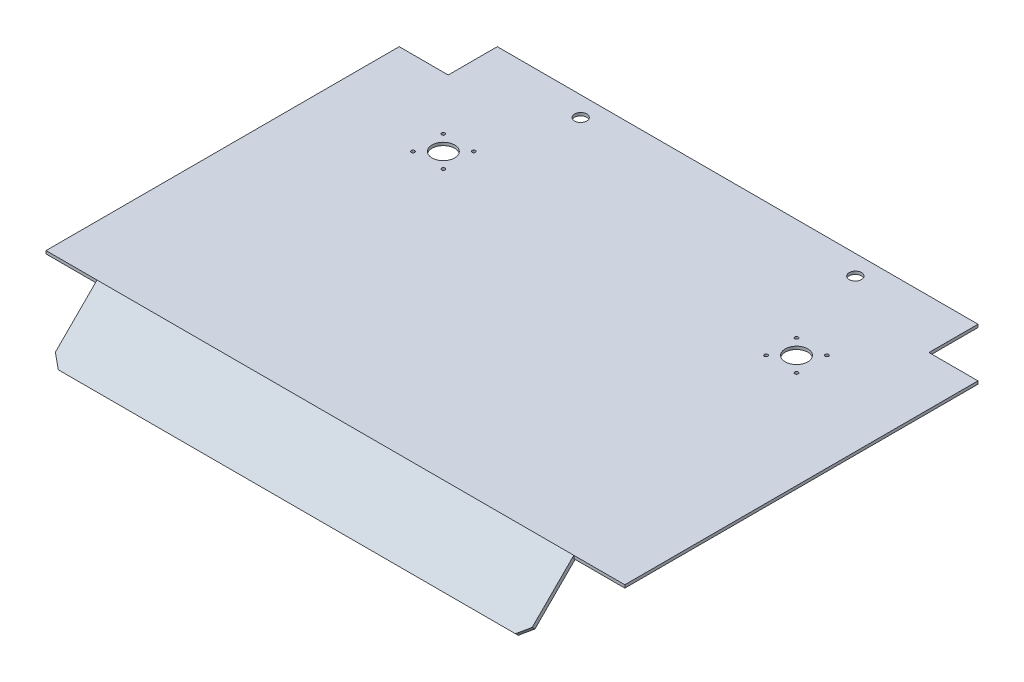
ISO-10303-21;
HEADER;
FILE_DESCRIPTION(('STEP AP214'),'2;1');
FILE_NAME('part.step','',(''),(''),'','','');
FILE_SCHEMA(('AUTOMOTIVE_DESIGN { 1 0 10303 214 1 1 1 1 }'));
ENDSEC;
DATA;
#1=APPLICATION_CONTEXT('core data for automotive mechanical design processes');
#2=APPLICATION_PROTOCOL_DEFINITION('international standard','automotive_design',2000,#1);
#3=PRODUCT_CONTEXT('',#1,'mechanical');
#4=PRODUCT('Part','Part','',(#3));
#5=PRODUCT_RELATED_PRODUCT_CATEGORY('part','',(#4));
#6=PRODUCT_DEFINITION_FORMATION('','',#4);
#7=PRODUCT_DEFINITION_CONTEXT('part definition',#1,'design');
#8=PRODUCT_DEFINITION('design','',#6,#7);
#9=PRODUCT_DEFINITION_SHAPE('','',#8);
#10=(LENGTH_UNIT() NAMED_UNIT(*) SI_UNIT(.MILLI.,.METRE.));
#11=(NAMED_UNIT(*) PLANE_ANGLE_UNIT() SI_UNIT($,.RADIAN.));
#12=(NAMED_UNIT(*) SI_UNIT($,.STERADIAN.) SOLID_ANGLE_UNIT());
#13=UNCERTAINTY_MEASURE_WITH_UNIT(LENGTH_MEASURE(1.E-05),#10,'distance_accuracy_value','');
#14=(GEOMETRIC_REPRESENTATION_CONTEXT(3) GLOBAL_UNCERTAINTY_ASSIGNED_CONTEXT((#13)) GLOBAL_UNIT_ASSIGNED_CONTEXT((#10,
#11,#12)) REPRESENTATION_CONTEXT('',''));
#15=CARTESIAN_POINT('',(0.,0.,0.));
#16=DIRECTION('',(0.,0.,1.));
#17=DIRECTION('',(1.,0.,0.));
#18=AXIS2_PLACEMENT_3D('',#15,#16,#17);
#19=CARTESIAN_POINT('',(368.372178114132,3.,114.515571385486));
#20=DIRECTION('',(0.,0.,-1.));
#21=DIRECTION('',(-1.,0.,0.));
#22=AXIS2_PLACEMENT_3D('',#19,#20,#21);
#23=PLANE('',#22);
#24=DIRECTION('',(1.,0.,0.));
#25=VECTOR('',#24,1.);
#26=CARTESIAN_POINT('',(368.372178114132,0.,114.515571385486));
#27=LINE('',#26,#25);
#28=CARTESIAN_POINT('',(-221.627821885868,0.,114.515571385486));
#29=VERTEX_POINT('',#28);
#30=CARTESIAN_POINT('',(-169.627821885868,0.,114.515571385486));
#31=VERTEX_POINT('',#30);
#32=EDGE_CURVE('E167',#29,#31,#27,.T.);
#33=ORIENTED_EDGE('',*,*,#32,.T.);
#34=DIRECTION('',(0.,1.,0.));
#35=VECTOR('',#34,1.);
#36=CARTESIAN_POINT('',(-169.627821885868,3.00000000000003,114.515571385486));
#37=LINE('',#36,#35);
#38=CARTESIAN_POINT('',(-169.627821885868,3.,114.515571385486));
#39=VERTEX_POINT('',#38);
#40=EDGE_CURVE('E145',#31,#39,#37,.T.);
#41=ORIENTED_EDGE('',*,*,#40,.T.);
#42=DIRECTION('',(1.,0.,0.));
#43=VECTOR('',#42,1.);
#44=CARTESIAN_POINT('',(368.372178114132,3.,114.515571385486));
#45=LINE('',#44,#43);
#46=CARTESIAN_POINT('',(-221.627821885868,3.,114.515571385486));
#47=VERTEX_POINT('',#46);
#48=EDGE_CURVE('E165',#47,#39,#45,.T.);
#49=ORIENTED_EDGE('',*,*,#48,.F.);
#50=DIRECTION('',(0.,-1.,0.));
#51=VECTOR('',#50,1.);
#52=CARTESIAN_POINT('',(-221.627821885868,3.,114.515571385486));
#53=LINE('',#52,#51);
#54=EDGE_CURVE('E228',#47,#29,#53,.T.);
#55=ORIENTED_EDGE('',*,*,#54,.T.);
#56=EDGE_LOOP('',(#33,#41,#49,#55));
#57=FACE_BOUND('',#56,.T.);
#58=ADVANCED_FACE('F33',(#57),#23,.F.);
#59=CARTESIAN_POINT('',(0.,3.,0.));
#60=DIRECTION('',(0.,1.,0.));
#61=DIRECTION('',(0.,0.,1.));
#62=AXIS2_PLACEMENT_3D('',#59,#60,#61);
#63=PLANE('',#62);
#64=CARTESIAN_POINT('',(-66.627821885868,3.,-275.484428614514));
#65=DIRECTION('',(0.,1.,0.));
#66=DIRECTION('',(0.,0.,1.));
#67=AXIS2_PLACEMENT_3D('',#64,#65,#66);
#68=CIRCLE('',#67,6.25000000000001);
#69=CARTESIAN_POINT('',(-66.627821885868,3.,-269.234428614514));
#70=VERTEX_POINT('',#69);
#71=EDGE_CURVE('E278',#70,#70,#68,.T.);
#72=ORIENTED_EDGE('',*,*,#71,.F.);
#73=EDGE_LOOP('',(#72));
#74=FACE_BOUND('',#73,.T.);
#75=CARTESIAN_POINT('',(268.872178114132,3.,-190.984428614514));
#76=DIRECTION('',(0.,1.,0.));
#77=DIRECTION('',(0.,0.,-1.));
#78=AXIS2_PLACEMENT_3D('',#75,#76,#77);
#79=CIRCLE('',#78,1.74999999999998);
#80=CARTESIAN_POINT('',(268.872178114132,3.,-192.734428614514));
#81=VERTEX_POINT('',#80);
#82=EDGE_CURVE('E290',#81,#81,#79,.T.);
#83=ORIENTED_EDGE('',*,*,#82,.F.);
#84=EDGE_LOOP('',(#83));
#85=FACE_BOUND('',#84,.T.);
#86=CARTESIAN_POINT('',(237.872178114132,3.,-159.984428614514));
#87=DIRECTION('',(0.,1.,0.));
#88=DIRECTION('',(0.,0.,-1.));
#89=AXIS2_PLACEMENT_3D('',#86,#87,#88);
#90=CIRCLE('',#89,1.75000000000004);
#91=CARTESIAN_POINT('',(237.872178114132,3.,-161.734428614514));
#92=VERTEX_POINT('',#91);
#93=EDGE_CURVE('E302',#92,#92,#90,.T.);
#94=ORIENTED_EDGE('',*,*,#93,.F.);
#95=EDGE_LOOP('',(#94));
#96=FACE_BOUND('',#95,.T.);
#97=CARTESIAN_POINT('',(-122.127821885868,3.,-159.984428614514));
#98=DIRECTION('',(0.,1.,0.));
#99=DIRECTION('',(0.,0.,1.));
#100=AXIS2_PLACEMENT_3D('',#97,#98,#99);
#101=CIRCLE('',#100,1.75);
#102=CARTESIAN_POINT('',(-122.127821885868,3.,-158.234428614514));
#103=VERTEX_POINT('',#102);
#104=EDGE_CURVE('E314',#103,#103,#101,.T.);
#105=ORIENTED_EDGE('',*,*,#104,.F.);
#106=EDGE_LOOP('',(#105));
#107=FACE_BOUND('',#106,.T.);
#108=CARTESIAN_POINT('',(-91.1278218858681,3.,-190.984428614514));
#109=DIRECTION('',(0.,1.,0.));
#110=DIRECTION('',(0.,0.,1.));
#111=AXIS2_PLACEMENT_3D('',#108,#109,#110);
#112=CIRCLE('',#111,1.75);
#113=CARTESIAN_POINT('',(-91.1278218858681,3.,-189.234428614514));
#114=VERTEX_POINT('',#113);
#115=EDGE_CURVE('E326',#114,#114,#112,.T.);
#116=ORIENTED_EDGE('',*,*,#115,.F.);
#117=EDGE_LOOP('',(#116));
#118=FACE_BOUND('',#117,.T.);
#119=CARTESIAN_POINT('',(-106.627821885868,3.,-175.484428614514));
#120=DIRECTION('',(0.,1.,0.));
#121=DIRECTION('',(0.,0.,1.));
#122=AXIS2_PLACEMENT_3D('',#119,#120,#121);
#123=CIRCLE('',#122,11.5);
#124=CARTESIAN_POINT('',(-106.627821885868,3.,-163.984428614514));
#125=VERTEX_POINT('',#124);
#126=EDGE_CURVE('E196',#125,#125,#123,.T.);
#127=ORIENTED_EDGE('',*,*,#126,.F.);
#128=EDGE_LOOP('',(#127));
#129=FACE_BOUND('',#128,.T.);
#130=DIRECTION('',(-1.,0.,0.));
#131=VECTOR('',#130,1.);
#132=CARTESIAN_POINT('',(-221.627821885868,3.,-245.484428614514));
#133=LINE('',#132,#131);
#134=CARTESIAN_POINT('',(-171.627821885868,3.,-245.484428614514));
#135=VERTEX_POINT('',#134);
#136=CARTESIAN_POINT('',(-221.627821885868,3.,-245.484428614514));
#137=VERTEX_POINT('',#136);
#138=EDGE_CURVE('E210',#135,#137,#133,.T.);
#139=ORIENTED_EDGE('',*,*,#138,.T.);
#140=DIRECTION('',(0.,0.,1.));
#141=VECTOR('',#140,1.);
#142=CARTESIAN_POINT('',(-221.627821885868,3.,114.515571385486));
#143=LINE('',#142,#141);
#144=EDGE_CURVE('E174',#137,#47,#143,.T.);
#145=ORIENTED_EDGE('',*,*,#144,.T.);
#146=ORIENTED_EDGE('',*,*,#48,.T.);
#147=DIRECTION('',(-1.,0.,0.));
#148=VECTOR('',#147,1.);
#149=CARTESIAN_POINT('',(-169.627821885868,3.,114.515571385486));
#150=LINE('',#149,#148);
#151=CARTESIAN_POINT('',(316.372178114132,3.,114.515571385486));
#152=VERTEX_POINT('',#151);
#153=EDGE_CURVE('E153',#152,#39,#150,.T.);
#154=ORIENTED_EDGE('',*,*,#153,.F.);
#155=CARTESIAN_POINT('',(368.372178114132,3.,114.515571385486));
#156=VERTEX_POINT('',#155);
#157=EDGE_CURVE('E177',#152,#156,#45,.T.);
#158=ORIENTED_EDGE('',*,*,#157,.T.);
#159=DIRECTION('',(0.,0.,-1.));
#160=VECTOR('',#159,1.);
#161=CARTESIAN_POINT('',(368.372178114132,3.,-245.484428614514));
#162=LINE('',#161,#160);
#163=CARTESIAN_POINT('',(368.372178114132,3.,-245.484428614514));
#164=VERTEX_POINT('',#163);
#165=EDGE_CURVE('E176',#156,#164,#162,.T.);
#166=ORIENTED_EDGE('',*,*,#165,.T.);
#167=DIRECTION('',(-1.,0.,0.));
#168=VECTOR('',#167,1.);
#169=CARTESIAN_POINT('',(318.372178114132,3.,-245.484428614514));
#170=LINE('',#169,#168);
#171=CARTESIAN_POINT('',(318.372178114132,3.,-245.484428614514));
#172=VERTEX_POINT('',#171);
#173=EDGE_CURVE('E179',#164,#172,#170,.T.);
#174=ORIENTED_EDGE('',*,*,#173,.T.);
#175=DIRECTION('',(0.,0.,-1.));
#176=VECTOR('',#175,1.);
#177=CARTESIAN_POINT('',(318.372178114132,3.,-295.484428614514));
#178=LINE('',#177,#176);
#179=CARTESIAN_POINT('',(318.372178114132,3.,-295.484428614514));
#180=VERTEX_POINT('',#179);
#181=EDGE_CURVE('E185',#172,#180,#178,.T.);
#182=ORIENTED_EDGE('',*,*,#181,.T.);
#183=DIRECTION('',(-1.,0.,0.));
#184=VECTOR('',#183,1.);
#185=CARTESIAN_POINT('',(-171.627821885868,3.,-295.484428614513));
#186=LINE('',#185,#184);
#187=CARTESIAN_POINT('',(-171.627821885868,3.,-295.484428614513));
#188=VERTEX_POINT('',#187);
#189=EDGE_CURVE('E187',#180,#188,#186,.T.);
#190=ORIENTED_EDGE('',*,*,#189,.T.);
#191=DIRECTION('',(0.,0.,1.));
#192=VECTOR('',#191,1.);
#193=CARTESIAN_POINT('',(-171.627821885868,3.,-245.484428614514));
#194=LINE('',#193,#192);
#195=EDGE_CURVE('E189',#188,#135,#194,.T.);
#196=ORIENTED_EDGE('',*,*,#195,.T.);
#197=EDGE_LOOP('',(#139,#145,#146,#154,#158,#166,#174,#182,#190,#196));
#198=FACE_BOUND('',#197,.T.);
#199=CARTESIAN_POINT('',(-122.127821885868,3.,-190.984428614514));
#200=DIRECTION('',(0.,1.,0.));
#201=DIRECTION('',(0.,0.,1.));
#202=AXIS2_PLACEMENT_3D('',#199,#200,#201);
#203=CIRCLE('',#202,1.75);
#204=CARTESIAN_POINT('',(-122.127821885868,3.,-189.234428614514));
#205=VERTEX_POINT('',#204);
#206=EDGE_CURVE('E332',#205,#205,#203,.T.);
#207=ORIENTED_EDGE('',*,*,#206,.F.);
#208=EDGE_LOOP('',(#207));
#209=FACE_BOUND('',#208,.T.);
#210=CARTESIAN_POINT('',(-91.1278218858681,3.,-159.984428614514));
#211=DIRECTION('',(0.,1.,0.));
#212=DIRECTION('',(0.,0.,1.));
#213=AXIS2_PLACEMENT_3D('',#210,#211,#212);
#214=CIRCLE('',#213,1.75);
#215=CARTESIAN_POINT('',(-91.1278218858681,3.,-158.234428614514));
#216=VERTEX_POINT('',#215);
#217=EDGE_CURVE('E320',#216,#216,#214,.T.);
#218=ORIENTED_EDGE('',*,*,#217,.F.);
#219=EDGE_LOOP('',(#218));
#220=FACE_BOUND('',#219,.T.);
#221=CARTESIAN_POINT('',(268.872178114132,3.,-159.984428614514));
#222=DIRECTION('',(0.,1.,0.));
#223=DIRECTION('',(0.,0.,-1.));
#224=AXIS2_PLACEMENT_3D('',#221,#222,#223);
#225=CIRCLE('',#224,1.74999999999993);
#226=CARTESIAN_POINT('',(268.872178114132,3.,-161.734428614514));
#227=VERTEX_POINT('',#226);
#228=EDGE_CURVE('E308',#227,#227,#225,.T.);
#229=ORIENTED_EDGE('',*,*,#228,.F.);
#230=EDGE_LOOP('',(#229));
#231=FACE_BOUND('',#230,.T.);
#232=CARTESIAN_POINT('',(237.872178114132,3.,-190.984428614514));
#233=DIRECTION('',(0.,1.,0.));
#234=DIRECTION('',(0.,0.,-1.));
#235=AXIS2_PLACEMENT_3D('',#232,#233,#234);
#236=CIRCLE('',#235,1.75000000000004);
#237=CARTESIAN_POINT('',(237.872178114132,3.,-192.734428614514));
#238=VERTEX_POINT('',#237);
#239=EDGE_CURVE('E296',#238,#238,#236,.T.);
#240=ORIENTED_EDGE('',*,*,#239,.F.);
#241=EDGE_LOOP('',(#240));
#242=FACE_BOUND('',#241,.T.);
#243=CARTESIAN_POINT('',(253.372178114132,3.,-175.484428614514));
#244=DIRECTION('',(0.,1.,0.));
#245=DIRECTION('',(0.,0.,-1.));
#246=AXIS2_PLACEMENT_3D('',#243,#244,#245);
#247=CIRCLE('',#246,11.5);
#248=CARTESIAN_POINT('',(253.372178114132,3.,-186.984428614514));
#249=VERTEX_POINT('',#248);
#250=EDGE_CURVE('E284',#249,#249,#247,.T.);
#251=ORIENTED_EDGE('',*,*,#250,.F.);
#252=EDGE_LOOP('',(#251));
#253=FACE_BOUND('',#252,.T.);
#254=CARTESIAN_POINT('',(213.372178114132,3.,-275.484428614514));
#255=DIRECTION('',(0.,1.,0.));
#256=DIRECTION('',(0.,0.,1.));
#257=AXIS2_PLACEMENT_3D('',#254,#255,#256);
#258=CIRCLE('',#257,6.25);
#259=CARTESIAN_POINT('',(213.372178114132,3.,-269.234428614514));
#260=VERTEX_POINT('',#259);
#261=EDGE_CURVE('E272',#260,#260,#258,.T.);
#262=ORIENTED_EDGE('',*,*,#261,.F.);
#263=EDGE_LOOP('',(#262));
#264=FACE_BOUND('',#263,.T.);
#265=ADVANCED_FACE('F172',(#74,#85,#96,#107,#118,#129,#198,#209,#220,#231,#242,#253,#264),#63,.T.);
#266=CARTESIAN_POINT('',(0.,0.,0.));
#267=DIRECTION('',(0.,1.,0.));
#268=DIRECTION('',(0.,0.,1.));
#269=AXIS2_PLACEMENT_3D('',#266,#267,#268);
#270=PLANE('',#269);
#271=DIRECTION('',(1.,0.,0.));
#272=VECTOR('',#271,1.);
#273=CARTESIAN_POINT('',(0.,0.,111.858717135994));
#274=LINE('',#273,#272);
#275=CARTESIAN_POINT('',(-169.627821885868,0.,111.858717135994));
#276=VERTEX_POINT('',#275);
#277=CARTESIAN_POINT('',(316.372178114132,0.,111.858717135994));
#278=VERTEX_POINT('',#277);
#279=EDGE_CURVE('E168',#276,#278,#274,.T.);
#280=ORIENTED_EDGE('',*,*,#279,.F.);
#281=DIRECTION('',(0.,0.,1.));
#282=VECTOR('',#281,1.);
#283=CARTESIAN_POINT('',(-169.627821885868,0.,0.));
#284=LINE('',#283,#282);
#285=EDGE_CURVE('E254',#276,#31,#284,.T.);
#286=ORIENTED_EDGE('',*,*,#285,.T.);
#287=ORIENTED_EDGE('',*,*,#32,.F.);
#288=DIRECTION('',(0.,0.,1.));
#289=VECTOR('',#288,1.);
#290=CARTESIAN_POINT('',(-221.627821885868,0.,114.515571385486));
#291=LINE('',#290,#289);
#292=CARTESIAN_POINT('',(-221.627821885868,0.,-245.484428614514));
#293=VERTEX_POINT('',#292);
#294=EDGE_CURVE('E195',#293,#29,#291,.T.);
#295=ORIENTED_EDGE('',*,*,#294,.F.);
#296=DIRECTION('',(-1.,0.,0.));
#297=VECTOR('',#296,1.);
#298=CARTESIAN_POINT('',(-221.627821885868,0.,-245.484428614514));
#299=LINE('',#298,#297);
#300=CARTESIAN_POINT('',(-171.627821885868,0.,-245.484428614514));
#301=VERTEX_POINT('',#300);
#302=EDGE_CURVE('E192',#301,#293,#299,.T.);
#303=ORIENTED_EDGE('',*,*,#302,.F.);
#304=DIRECTION('',(0.,0.,1.));
#305=VECTOR('',#304,1.);
#306=CARTESIAN_POINT('',(-171.627821885868,0.,-245.484428614514));
#307=LINE('',#306,#305);
#308=CARTESIAN_POINT('',(-171.627821885868,0.,-295.484428614513));
#309=VERTEX_POINT('',#308);
#310=EDGE_CURVE('E208',#309,#301,#307,.T.);
#311=ORIENTED_EDGE('',*,*,#310,.F.);
#312=DIRECTION('',(-1.,0.,0.));
#313=VECTOR('',#312,1.);
#314=CARTESIAN_POINT('',(-171.627821885868,0.,-295.484428614513));
#315=LINE('',#314,#313);
#316=CARTESIAN_POINT('',(318.372178114132,0.,-295.484428614514));
#317=VERTEX_POINT('',#316);
#318=EDGE_CURVE('E206',#317,#309,#315,.T.);
#319=ORIENTED_EDGE('',*,*,#318,.F.);
#320=DIRECTION('',(0.,0.,-1.));
#321=VECTOR('',#320,1.);
#322=CARTESIAN_POINT('',(318.372178114132,0.,-295.484428614514));
#323=LINE('',#322,#321);
#324=CARTESIAN_POINT('',(318.372178114132,0.,-245.484428614514));
#325=VERTEX_POINT('',#324);
#326=EDGE_CURVE('E204',#325,#317,#323,.T.);
#327=ORIENTED_EDGE('',*,*,#326,.F.);
#328=DIRECTION('',(-1.,0.,0.));
#329=VECTOR('',#328,1.);
#330=CARTESIAN_POINT('',(318.372178114132,0.,-245.484428614514));
#331=LINE('',#330,#329);
#332=CARTESIAN_POINT('',(368.372178114132,0.,-245.484428614514));
#333=VERTEX_POINT('',#332);
#334=EDGE_CURVE('E202',#333,#325,#331,.T.);
#335=ORIENTED_EDGE('',*,*,#334,.F.);
#336=DIRECTION('',(0.,0.,-1.));
#337=VECTOR('',#336,1.);
#338=CARTESIAN_POINT('',(368.372178114132,0.,-245.484428614514));
#339=LINE('',#338,#337);
#340=CARTESIAN_POINT('',(368.372178114132,0.,114.515571385486));
#341=VERTEX_POINT('',#340);
#342=EDGE_CURVE('E200',#341,#333,#339,.T.);
#343=ORIENTED_EDGE('',*,*,#342,.F.);
#344=CARTESIAN_POINT('',(316.372178114132,0.,114.515571385486));
#345=VERTEX_POINT('',#344);
#346=EDGE_CURVE('E198',#345,#341,#27,.T.);
#347=ORIENTED_EDGE('',*,*,#346,.F.);
#348=DIRECTION('',(0.,0.,-1.));
#349=VECTOR('',#348,1.);
#350=CARTESIAN_POINT('',(316.372178114132,0.,0.));
#351=LINE('',#350,#349);
#352=EDGE_CURVE('E266',#345,#278,#351,.T.);
#353=ORIENTED_EDGE('',*,*,#352,.T.);
#354=EDGE_LOOP('',(#280,#286,#287,#295,#303,#311,#319,#327,#335,#343,#347,#353));
#355=FACE_BOUND('',#354,.T.);
#356=CARTESIAN_POINT('',(-106.627821885868,0.,-175.484428614514));
#357=DIRECTION('',(0.,1.,0.));
#358=DIRECTION('',(0.,0.,1.));
#359=AXIS2_PLACEMENT_3D('',#356,#357,#358);
#360=CIRCLE('',#359,11.5);
#361=CARTESIAN_POINT('',(-106.627821885868,0.,-163.984428614514));
#362=VERTEX_POINT('',#361);
#363=EDGE_CURVE('E335',#362,#362,#360,.T.);
#364=ORIENTED_EDGE('',*,*,#363,.T.);
#365=EDGE_LOOP('',(#364));
#366=FACE_BOUND('',#365,.T.);
#367=CARTESIAN_POINT('',(-122.127821885868,0.,-190.984428614514));
#368=DIRECTION('',(0.,1.,0.));
#369=DIRECTION('',(0.,0.,1.));
#370=AXIS2_PLACEMENT_3D('',#367,#368,#369);
#371=CIRCLE('',#370,1.75);
#372=CARTESIAN_POINT('',(-122.127821885868,0.,-189.234428614514));
#373=VERTEX_POINT('',#372);
#374=EDGE_CURVE('E329',#373,#373,#371,.T.);
#375=ORIENTED_EDGE('',*,*,#374,.T.);
#376=EDGE_LOOP('',(#375));
#377=FACE_BOUND('',#376,.T.);
#378=CARTESIAN_POINT('',(-91.1278218858681,0.,-190.984428614514));
#379=DIRECTION('',(0.,1.,0.));
#380=DIRECTION('',(0.,0.,1.));
#381=AXIS2_PLACEMENT_3D('',#378,#379,#380);
#382=CIRCLE('',#381,1.75);
#383=CARTESIAN_POINT('',(-91.1278218858681,0.,-189.234428614514));
#384=VERTEX_POINT('',#383);
#385=EDGE_CURVE('E323',#384,#384,#382,.T.);
#386=ORIENTED_EDGE('',*,*,#385,.T.);
#387=EDGE_LOOP('',(#386));
#388=FACE_BOUND('',#387,.T.);
#389=CARTESIAN_POINT('',(-91.1278218858681,0.,-159.984428614514));
#390=DIRECTION('',(0.,1.,0.));
#391=DIRECTION('',(0.,0.,1.));
#392=AXIS2_PLACEMENT_3D('',#389,#390,#391);
#393=CIRCLE('',#392,1.75);
#394=CARTESIAN_POINT('',(-91.1278218858681,0.,-158.234428614514));
#395=VERTEX_POINT('',#394);
#396=EDGE_CURVE('E317',#395,#395,#393,.T.);
#397=ORIENTED_EDGE('',*,*,#396,.T.);
#398=EDGE_LOOP('',(#397));
#399=FACE_BOUND('',#398,.T.);
#400=CARTESIAN_POINT('',(-122.127821885868,0.,-159.984428614514));
#401=DIRECTION('',(0.,1.,0.));
#402=DIRECTION('',(0.,0.,1.));
#403=AXIS2_PLACEMENT_3D('',#400,#401,#402);
#404=CIRCLE('',#403,1.75);
#405=CARTESIAN_POINT('',(-122.127821885868,0.,-158.234428614514));
#406=VERTEX_POINT('',#405);
#407=EDGE_CURVE('E311',#406,#406,#404,.T.);
#408=ORIENTED_EDGE('',*,*,#407,.T.);
#409=EDGE_LOOP('',(#408));
#410=FACE_BOUND('',#409,.T.);
#411=CARTESIAN_POINT('',(268.872178114132,0.,-159.984428614514));
#412=DIRECTION('',(0.,1.,0.));
#413=DIRECTION('',(0.,0.,-1.));
#414=AXIS2_PLACEMENT_3D('',#411,#412,#413);
#415=CIRCLE('',#414,1.74999999999993);
#416=CARTESIAN_POINT('',(268.872178114132,0.,-161.734428614514));
#417=VERTEX_POINT('',#416);
#418=EDGE_CURVE('E305',#417,#417,#415,.T.);
#419=ORIENTED_EDGE('',*,*,#418,.T.);
#420=EDGE_LOOP('',(#419));
#421=FACE_BOUND('',#420,.T.);
#422=CARTESIAN_POINT('',(237.872178114132,0.,-159.984428614514));
#423=DIRECTION('',(0.,1.,0.));
#424=DIRECTION('',(0.,0.,-1.));
#425=AXIS2_PLACEMENT_3D('',#422,#423,#424);
#426=CIRCLE('',#425,1.75000000000004);
#427=CARTESIAN_POINT('',(237.872178114132,0.,-161.734428614514));
#428=VERTEX_POINT('',#427);
#429=EDGE_CURVE('E299',#428,#428,#426,.T.);
#430=ORIENTED_EDGE('',*,*,#429,.T.);
#431=EDGE_LOOP('',(#430));
#432=FACE_BOUND('',#431,.T.);
#433=CARTESIAN_POINT('',(237.872178114132,0.,-190.984428614514));
#434=DIRECTION('',(0.,1.,0.));
#435=DIRECTION('',(0.,0.,-1.));
#436=AXIS2_PLACEMENT_3D('',#433,#434,#435);
#437=CIRCLE('',#436,1.75000000000004);
#438=CARTESIAN_POINT('',(237.872178114132,0.,-192.734428614514));
#439=VERTEX_POINT('',#438);
#440=EDGE_CURVE('E293',#439,#439,#437,.T.);
#441=ORIENTED_EDGE('',*,*,#440,.T.);
#442=EDGE_LOOP('',(#441));
#443=FACE_BOUND('',#442,.T.);
#444=CARTESIAN_POINT('',(268.872178114132,0.,-190.984428614514));
#445=DIRECTION('',(0.,1.,0.));
#446=DIRECTION('',(0.,0.,-1.));
#447=AXIS2_PLACEMENT_3D('',#444,#445,#446);
#448=CIRCLE('',#447,1.74999999999998);
#449=CARTESIAN_POINT('',(268.872178114132,0.,-192.734428614514));
#450=VERTEX_POINT('',#449);
#451=EDGE_CURVE('E287',#450,#450,#448,.T.);
#452=ORIENTED_EDGE('',*,*,#451,.T.);
#453=EDGE_LOOP('',(#452));
#454=FACE_BOUND('',#453,.T.);
#455=CARTESIAN_POINT('',(253.372178114132,0.,-175.484428614514));
#456=DIRECTION('',(0.,1.,0.));
#457=DIRECTION('',(0.,0.,-1.));
#458=AXIS2_PLACEMENT_3D('',#455,#456,#457);
#459=CIRCLE('',#458,11.5);
#460=CARTESIAN_POINT('',(253.372178114132,0.,-186.984428614514));
#461=VERTEX_POINT('',#460);
#462=EDGE_CURVE('E281',#461,#461,#459,.T.);
#463=ORIENTED_EDGE('',*,*,#462,.T.);
#464=EDGE_LOOP('',(#463));
#465=FACE_BOUND('',#464,.T.);
#466=CARTESIAN_POINT('',(-66.627821885868,0.,-275.484428614514));
#467=DIRECTION('',(0.,1.,0.));
#468=DIRECTION('',(0.,0.,1.));
#469=AXIS2_PLACEMENT_3D('',#466,#467,#468);
#470=CIRCLE('',#469,6.25000000000001);
#471=CARTESIAN_POINT('',(-66.627821885868,0.,-269.234428614514));
#472=VERTEX_POINT('',#471);
#473=EDGE_CURVE('E275',#472,#472,#470,.T.);
#474=ORIENTED_EDGE('',*,*,#473,.T.);
#475=EDGE_LOOP('',(#474));
#476=FACE_BOUND('',#475,.T.);
#477=CARTESIAN_POINT('',(213.372178114132,0.,-275.484428614514));
#478=DIRECTION('',(0.,1.,0.));
#479=DIRECTION('',(0.,0.,1.));
#480=AXIS2_PLACEMENT_3D('',#477,#478,#479);
#481=CIRCLE('',#480,6.25);
#482=CARTESIAN_POINT('',(213.372178114132,0.,-269.234428614514));
#483=VERTEX_POINT('',#482);
#484=EDGE_CURVE('E271',#483,#483,#481,.T.);
#485=ORIENTED_EDGE('',*,*,#484,.T.);
#486=EDGE_LOOP('',(#485));
#487=FACE_BOUND('',#486,.T.);
#488=ADVANCED_FACE('F351',(#355,#366,#377,#388,#399,#410,#421,#432,#443,#454,#465,#476,#487),
#270,.F.);
#489=CARTESIAN_POINT('',(-221.627821885868,3.,-245.484428614514));
#490=DIRECTION('',(0.,0.,1.));
#491=DIRECTION('',(1.,0.,0.));
#492=AXIS2_PLACEMENT_3D('',#489,#490,#491);
#493=PLANE('',#492);
#494=ORIENTED_EDGE('',*,*,#302,.T.);
#495=DIRECTION('',(0.,-1.,0.));
#496=VECTOR('',#495,1.);
#497=CARTESIAN_POINT('',(-221.627821885868,3.,-245.484428614514));
#498=LINE('',#497,#496);
#499=EDGE_CURVE('E230',#137,#293,#498,.T.);
#500=ORIENTED_EDGE('',*,*,#499,.F.);
#501=ORIENTED_EDGE('',*,*,#138,.F.);
#502=DIRECTION('',(0.,-1.,0.));
#503=VECTOR('',#502,1.);
#504=CARTESIAN_POINT('',(-171.627821885868,3.,-245.484428614514));
#505=LINE('',#504,#503);
#506=EDGE_CURVE('E191',#135,#301,#505,.T.);
#507=ORIENTED_EDGE('',*,*,#506,.T.);
#508=EDGE_LOOP('',(#494,#500,#501,#507));
#509=FACE_BOUND('',#508,.T.);
#510=ADVANCED_FACE('F346',(#509),#493,.F.);
#511=CARTESIAN_POINT('',(-221.627821885868,3.,114.515571385486));
#512=DIRECTION('',(1.,0.,0.));
#513=DIRECTION('',(0.,0.,-1.));
#514=AXIS2_PLACEMENT_3D('',#511,#512,#513);
#515=PLANE('',#514);
#516=ORIENTED_EDGE('',*,*,#294,.T.);
#517=ORIENTED_EDGE('',*,*,#54,.F.);
#518=ORIENTED_EDGE('',*,*,#144,.F.);
#519=ORIENTED_EDGE('',*,*,#499,.T.);
#520=EDGE_LOOP('',(#516,#517,#518,#519));
#521=FACE_BOUND('',#520,.T.);
#522=ADVANCED_FACE('F349',(#521),#515,.F.);
#523=ORIENTED_EDGE('',*,*,#157,.F.);
#524=DIRECTION('',(0.,-1.,0.));
#525=VECTOR('',#524,1.);
#526=CARTESIAN_POINT('',(316.372178114132,3.,114.515571385486));
#527=LINE('',#526,#525);
#528=EDGE_CURVE('E169',#152,#345,#527,.T.);
#529=ORIENTED_EDGE('',*,*,#528,.T.);
#530=ORIENTED_EDGE('',*,*,#346,.T.);
#531=DIRECTION('',(0.,-1.,0.));
#532=VECTOR('',#531,1.);
#533=CARTESIAN_POINT('',(368.372178114132,3.,114.515571385486));
#534=LINE('',#533,#532);
#535=EDGE_CURVE('E225',#156,#341,#534,.T.);
#536=ORIENTED_EDGE('',*,*,#535,.F.);
#537=EDGE_LOOP('',(#523,#529,#530,#536));
#538=FACE_BOUND('',#537,.T.);
#539=ADVANCED_FACE('F359',(#538),#23,.F.);
#540=CARTESIAN_POINT('',(368.372178114132,3.,-245.484428614514));
#541=DIRECTION('',(-1.,0.,0.));
#542=DIRECTION('',(0.,0.,1.));
#543=AXIS2_PLACEMENT_3D('',#540,#541,#542);
#544=PLANE('',#543);
#545=ORIENTED_EDGE('',*,*,#342,.T.);
#546=DIRECTION('',(0.,-1.,0.));
#547=VECTOR('',#546,1.);
#548=CARTESIAN_POINT('',(368.372178114132,3.,-245.484428614514));
#549=LINE('',#548,#547);
#550=EDGE_CURVE('E222',#164,#333,#549,.T.);
#551=ORIENTED_EDGE('',*,*,#550,.F.);
#552=ORIENTED_EDGE('',*,*,#165,.F.);
#553=ORIENTED_EDGE('',*,*,#535,.T.);
#554=EDGE_LOOP('',(#545,#551,#552,#553));
#555=FACE_BOUND('',#554,.T.);
#556=ADVANCED_FACE('F365',(#555),#544,.F.);
#557=CARTESIAN_POINT('',(318.372178114132,3.,-245.484428614514));
#558=DIRECTION('',(0.,0.,1.));
#559=DIRECTION('',(1.,0.,0.));
#560=AXIS2_PLACEMENT_3D('',#557,#558,#559);
#561=PLANE('',#560);
#562=ORIENTED_EDGE('',*,*,#334,.T.);
#563=DIRECTION('',(0.,-1.,0.));
#564=VECTOR('',#563,1.);
#565=CARTESIAN_POINT('',(318.372178114132,3.,-245.484428614514));
#566=LINE('',#565,#564);
#567=EDGE_CURVE('E219',#172,#325,#566,.T.);
#568=ORIENTED_EDGE('',*,*,#567,.F.);
#569=ORIENTED_EDGE('',*,*,#173,.F.);
#570=ORIENTED_EDGE('',*,*,#550,.T.);
#571=EDGE_LOOP('',(#562,#568,#569,#570));
#572=FACE_BOUND('',#571,.T.);
#573=ADVANCED_FACE('F369',(#572),#561,.F.);
#574=CARTESIAN_POINT('',(318.372178114132,3.,-295.484428614514));
#575=DIRECTION('',(-1.,0.,0.));
#576=DIRECTION('',(0.,0.,1.));
#577=AXIS2_PLACEMENT_3D('',#574,#575,#576);
#578=PLANE('',#577);
#579=ORIENTED_EDGE('',*,*,#326,.T.);
#580=DIRECTION('',(0.,-1.,0.));
#581=VECTOR('',#580,1.);
#582=CARTESIAN_POINT('',(318.372178114132,3.,-295.484428614514));
#583=LINE('',#582,#581);
#584=EDGE_CURVE('E216',#180,#317,#583,.T.);
#585=ORIENTED_EDGE('',*,*,#584,.F.);
#586=ORIENTED_EDGE('',*,*,#181,.F.);
#587=ORIENTED_EDGE('',*,*,#567,.T.);
#588=EDGE_LOOP('',(#579,#585,#586,#587));
#589=FACE_BOUND('',#588,.T.);
#590=ADVANCED_FACE('F374',(#589),#578,.F.);
#591=CARTESIAN_POINT('',(-171.627821885868,3.,-295.484428614513));
#592=DIRECTION('',(0.,0.,1.));
#593=DIRECTION('',(1.,0.,0.));
#594=AXIS2_PLACEMENT_3D('',#591,#592,#593);
#595=PLANE('',#594);
#596=ORIENTED_EDGE('',*,*,#318,.T.);
#597=DIRECTION('',(0.,-1.,0.));
#598=VECTOR('',#597,1.);
#599=CARTESIAN_POINT('',(-171.627821885868,3.,-295.484428614513));
#600=LINE('',#599,#598);
#601=EDGE_CURVE('E213',#188,#309,#600,.T.);
#602=ORIENTED_EDGE('',*,*,#601,.F.);
#603=ORIENTED_EDGE('',*,*,#189,.F.);
#604=ORIENTED_EDGE('',*,*,#584,.T.);
#605=EDGE_LOOP('',(#596,#602,#603,#604));
#606=FACE_BOUND('',#605,.T.);
#607=ADVANCED_FACE('F378',(#606),#595,.F.);
#608=CARTESIAN_POINT('',(-171.627821885868,3.,-245.484428614514));
#609=DIRECTION('',(1.,0.,0.));
#610=DIRECTION('',(0.,0.,-1.));
#611=AXIS2_PLACEMENT_3D('',#608,#609,#610);
#612=PLANE('',#611);
#613=ORIENTED_EDGE('',*,*,#310,.T.);
#614=ORIENTED_EDGE('',*,*,#506,.F.);
#615=ORIENTED_EDGE('',*,*,#195,.F.);
#616=ORIENTED_EDGE('',*,*,#601,.T.);
#617=EDGE_LOOP('',(#613,#614,#615,#616));
#618=FACE_BOUND('',#617,.T.);
#619=ADVANCED_FACE('F382',(#618),#612,.F.);
#620=CARTESIAN_POINT('',(-106.627821885868,3.,-175.484428614514));
#621=DIRECTION('',(0.,-1.,0.));
#622=DIRECTION('',(0.,0.,-1.));
#623=AXIS2_PLACEMENT_3D('',#620,#621,#622);
#624=CYLINDRICAL_SURFACE('',#623,11.5);
#625=ORIENTED_EDGE('',*,*,#126,.T.);
#626=EDGE_LOOP('',(#625));
#627=FACE_BOUND('',#626,.T.);
#628=ORIENTED_EDGE('',*,*,#363,.F.);
#629=EDGE_LOOP('',(#628));
#630=FACE_BOUND('',#629,.T.);
#631=ADVANCED_FACE('F384',(#627,#630),#624,.F.);
#632=CARTESIAN_POINT('',(-122.127821885868,3.,-190.984428614514));
#633=DIRECTION('',(0.,-1.,0.));
#634=DIRECTION('',(0.,0.,-1.));
#635=AXIS2_PLACEMENT_3D('',#632,#633,#634);
#636=CYLINDRICAL_SURFACE('',#635,1.75);
#637=ORIENTED_EDGE('',*,*,#206,.T.);
#638=EDGE_LOOP('',(#637));
#639=FACE_BOUND('',#638,.T.);
#640=ORIENTED_EDGE('',*,*,#374,.F.);
#641=EDGE_LOOP('',(#640));
#642=FACE_BOUND('',#641,.T.);
#643=ADVANCED_FACE('F390',(#639,#642),#636,.F.);
#644=CARTESIAN_POINT('',(-91.1278218858681,3.,-190.984428614514));
#645=DIRECTION('',(0.,-1.,0.));
#646=DIRECTION('',(0.,0.,-1.));
#647=AXIS2_PLACEMENT_3D('',#644,#645,#646);
#648=CYLINDRICAL_SURFACE('',#647,1.75);
#649=ORIENTED_EDGE('',*,*,#115,.T.);
#650=EDGE_LOOP('',(#649));
#651=FACE_BOUND('',#650,.T.);
#652=ORIENTED_EDGE('',*,*,#385,.F.);
#653=EDGE_LOOP('',(#652));
#654=FACE_BOUND('',#653,.T.);
#655=ADVANCED_FACE('F464',(#651,#654),#648,.F.);
#656=CARTESIAN_POINT('',(-91.1278218858681,3.,-159.984428614514));
#657=DIRECTION('',(0.,-1.,0.));
#658=DIRECTION('',(0.,0.,-1.));
#659=AXIS2_PLACEMENT_3D('',#656,#657,#658);
#660=CYLINDRICAL_SURFACE('',#659,1.75);
#661=ORIENTED_EDGE('',*,*,#217,.T.);
#662=EDGE_LOOP('',(#661));
#663=FACE_BOUND('',#662,.T.);
#664=ORIENTED_EDGE('',*,*,#396,.F.);
#665=EDGE_LOOP('',(#664));
#666=FACE_BOUND('',#665,.T.);
#667=ADVANCED_FACE('F460',(#663,#666),#660,.F.);
#668=CARTESIAN_POINT('',(-122.127821885868,3.,-159.984428614514));
#669=DIRECTION('',(0.,-1.,0.));
#670=DIRECTION('',(0.,0.,-1.));
#671=AXIS2_PLACEMENT_3D('',#668,#669,#670);
#672=CYLINDRICAL_SURFACE('',#671,1.75);
#673=ORIENTED_EDGE('',*,*,#104,.T.);
#674=EDGE_LOOP('',(#673));
#675=FACE_BOUND('',#674,.T.);
#676=ORIENTED_EDGE('',*,*,#407,.F.);
#677=EDGE_LOOP('',(#676));
#678=FACE_BOUND('',#677,.T.);
#679=ADVANCED_FACE('F456',(#675,#678),#672,.F.);
#680=CARTESIAN_POINT('',(268.872178114132,3.,-159.984428614514));
#681=DIRECTION('',(0.,-1.,0.));
#682=DIRECTION('',(0.,0.,-1.));
#683=AXIS2_PLACEMENT_3D('',#680,#681,#682);
#684=CYLINDRICAL_SURFACE('',#683,1.74999999999993);
#685=ORIENTED_EDGE('',*,*,#228,.T.);
#686=EDGE_LOOP('',(#685));
#687=FACE_BOUND('',#686,.T.);
#688=ORIENTED_EDGE('',*,*,#418,.F.);
#689=EDGE_LOOP('',(#688));
#690=FACE_BOUND('',#689,.T.);
#691=ADVANCED_FACE('F452',(#687,#690),#684,.F.);
#692=CARTESIAN_POINT('',(237.872178114132,3.,-159.984428614514));
#693=DIRECTION('',(0.,-1.,0.));
#694=DIRECTION('',(0.,0.,-1.));
#695=AXIS2_PLACEMENT_3D('',#692,#693,#694);
#696=CYLINDRICAL_SURFACE('',#695,1.75000000000004);
#697=ORIENTED_EDGE('',*,*,#93,.T.);
#698=EDGE_LOOP('',(#697));
#699=FACE_BOUND('',#698,.T.);
#700=ORIENTED_EDGE('',*,*,#429,.F.);
#701=EDGE_LOOP('',(#700));
#702=FACE_BOUND('',#701,.T.);
#703=ADVANCED_FACE('F448',(#699,#702),#696,.F.);
#704=CARTESIAN_POINT('',(237.872178114132,3.,-190.984428614514));
#705=DIRECTION('',(0.,-1.,0.));
#706=DIRECTION('',(0.,0.,-1.));
#707=AXIS2_PLACEMENT_3D('',#704,#705,#706);
#708=CYLINDRICAL_SURFACE('',#707,1.75000000000004);
#709=ORIENTED_EDGE('',*,*,#239,.T.);
#710=EDGE_LOOP('',(#709));
#711=FACE_BOUND('',#710,.T.);
#712=ORIENTED_EDGE('',*,*,#440,.F.);
#713=EDGE_LOOP('',(#712));
#714=FACE_BOUND('',#713,.T.);
#715=ADVANCED_FACE('F444',(#711,#714),#708,.F.);
#716=CARTESIAN_POINT('',(268.872178114132,3.,-190.984428614514));
#717=DIRECTION('',(0.,-1.,0.));
#718=DIRECTION('',(0.,0.,-1.));
#719=AXIS2_PLACEMENT_3D('',#716,#717,#718);
#720=CYLINDRICAL_SURFACE('',#719,1.74999999999998);
#721=ORIENTED_EDGE('',*,*,#82,.T.);
#722=EDGE_LOOP('',(#721));
#723=FACE_BOUND('',#722,.T.);
#724=ORIENTED_EDGE('',*,*,#451,.F.);
#725=EDGE_LOOP('',(#724));
#726=FACE_BOUND('',#725,.T.);
#727=ADVANCED_FACE('F440',(#723,#726),#720,.F.);
#728=CARTESIAN_POINT('',(253.372178114132,3.,-175.484428614514));
#729=DIRECTION('',(0.,-1.,0.));
#730=DIRECTION('',(0.,0.,-1.));
#731=AXIS2_PLACEMENT_3D('',#728,#729,#730);
#732=CYLINDRICAL_SURFACE('',#731,11.5);
#733=ORIENTED_EDGE('',*,*,#250,.T.);
#734=EDGE_LOOP('',(#733));
#735=FACE_BOUND('',#734,.T.);
#736=ORIENTED_EDGE('',*,*,#462,.F.);
#737=EDGE_LOOP('',(#736));
#738=FACE_BOUND('',#737,.T.);
#739=ADVANCED_FACE('F436',(#735,#738),#732,.F.);
#740=CARTESIAN_POINT('',(-66.627821885868,3.,-275.484428614514));
#741=DIRECTION('',(0.,-1.,0.));
#742=DIRECTION('',(0.,0.,-1.));
#743=AXIS2_PLACEMENT_3D('',#740,#741,#742);
#744=CYLINDRICAL_SURFACE('',#743,6.25000000000001);
#745=ORIENTED_EDGE('',*,*,#71,.T.);
#746=EDGE_LOOP('',(#745));
#747=FACE_BOUND('',#746,.T.);
#748=ORIENTED_EDGE('',*,*,#473,.F.);
#749=EDGE_LOOP('',(#748));
#750=FACE_BOUND('',#749,.T.);
#751=ADVANCED_FACE('F432',(#747,#750),#744,.F.);
#752=CARTESIAN_POINT('',(213.372178114132,3.,-275.484428614514));
#753=DIRECTION('',(0.,-1.,0.));
#754=DIRECTION('',(0.,0.,-1.));
#755=AXIS2_PLACEMENT_3D('',#752,#753,#754);
#756=CYLINDRICAL_SURFACE('',#755,6.25);
#757=ORIENTED_EDGE('',*,*,#261,.T.);
#758=EDGE_LOOP('',(#757));
#759=FACE_BOUND('',#758,.T.);
#760=ORIENTED_EDGE('',*,*,#484,.F.);
#761=EDGE_LOOP('',(#760));
#762=FACE_BOUND('',#761,.T.);
#763=ADVANCED_FACE('F429',(#759,#762),#756,.F.);
#764=CARTESIAN_POINT('',(0.,55.929358567997,55.9293585679973));
#765=DIRECTION('',(0.,0.707106781186546,0.707106781186549));
#766=DIRECTION('',(0.,-0.707106781186549,0.707106781186546));
#767=AXIS2_PLACEMENT_3D('',#764,#765,#766);
#768=PLANE('',#767);
#769=DIRECTION('',(1.,0.,0.));
#770=VECTOR('',#769,1.);
#771=CARTESIAN_POINT('',(-169.627821885868,-49.3259018078046,161.184618943799));
#772=LINE('',#771,#770);
#773=CARTESIAN_POINT('',(-159.627821885868,-49.3259018078046,161.184618943799));
#774=VERTEX_POINT('',#773);
#775=CARTESIAN_POINT('',(306.372178114132,-49.3259018078046,161.184618943798));
#776=VERTEX_POINT('',#775);
#777=EDGE_CURVE('E251',#774,#776,#772,.T.);
#778=ORIENTED_EDGE('',*,*,#777,.F.);
#779=DIRECTION('',(0.70710678118655,-0.499999999999999,0.499999999999997));
#780=VECTOR('',#779,1.);
#781=CARTESIAN_POINT('',(-169.627821885868,-42.2548339959392,154.113551131933));
#782=LINE('',#781,#780);
#783=CARTESIAN_POINT('',(-169.627821885868,-42.2548339959393,154.113551131933));
#784=VERTEX_POINT('',#783);
#785=EDGE_CURVE('E41',#774,#784,#782,.F.);
#786=ORIENTED_EDGE('',*,*,#785,.T.);
#787=DIRECTION('',(0.,-0.707106781186549,0.707106781186546));
#788=VECTOR('',#787,1.);
#789=CARTESIAN_POINT('',(-169.627821885868,0.171572875253817,111.68714426074));
#790=LINE('',#789,#788);
#791=EDGE_CURVE('E159',#276,#784,#790,.T.);
#792=ORIENTED_EDGE('',*,*,#791,.F.);
#793=ORIENTED_EDGE('',*,*,#279,.T.);
#794=DIRECTION('',(0.,0.707106781186549,-0.707106781186546));
#795=VECTOR('',#794,1.);
#796=CARTESIAN_POINT('',(316.372178114132,0.171572875253817,111.68714426074));
#797=LINE('',#796,#795);
#798=CARTESIAN_POINT('',(316.372178114132,-42.2548339959391,154.113551131933));
#799=VERTEX_POINT('',#798);
#800=EDGE_CURVE('E269',#799,#278,#797,.T.);
#801=ORIENTED_EDGE('',*,*,#800,.F.);
#802=DIRECTION('',(0.707106781186545,0.500000000000003,-0.500000000000001));
#803=VECTOR('',#802,1.);
#804=CARTESIAN_POINT('',(306.372178114132,-49.3259018078046,161.184618943798));
#805=LINE('',#804,#803);
#806=EDGE_CURVE('E53',#799,#776,#805,.F.);
#807=ORIENTED_EDGE('',*,*,#806,.T.);
#808=EDGE_LOOP('',(#778,#786,#792,#793,#801,#807));
#809=FACE_BOUND('',#808,.T.);
#810=ADVANCED_FACE('F249',(#809),#768,.F.);
#811=CARTESIAN_POINT('',(-169.627821885868,0.171572875253817,111.68714426074));
#812=DIRECTION('',(-1.,0.,0.));
#813=DIRECTION('',(0.,0.,1.));
#814=AXIS2_PLACEMENT_3D('',#811,#812,#813);
#815=PLANE('',#814);
#816=ORIENTED_EDGE('',*,*,#791,.T.);
#817=DIRECTION('',(0.,0.707106781186546,0.707106781186549));
#818=VECTOR('',#817,1.);
#819=CARTESIAN_POINT('',(-169.627821885868,-42.2548339959392,154.113551131933));
#820=LINE('',#819,#818);
#821=CARTESIAN_POINT('',(-169.627821885868,-39.4264068711931,156.941978256679));
#822=VERTEX_POINT('',#821);
#823=EDGE_CURVE('E148',#784,#822,#820,.T.);
#824=ORIENTED_EDGE('',*,*,#823,.T.);
#825=DIRECTION('',(0.,-0.707106781186549,0.707106781186546));
#826=VECTOR('',#825,1.);
#827=CARTESIAN_POINT('',(-169.627821885868,3.,114.515571385486));
#828=LINE('',#827,#826);
#829=EDGE_CURVE('E140',#39,#822,#828,.T.);
#830=ORIENTED_EDGE('',*,*,#829,.F.);
#831=ORIENTED_EDGE('',*,*,#40,.F.);
#832=ORIENTED_EDGE('',*,*,#285,.F.);
#833=EDGE_LOOP('',(#816,#824,#830,#831,#832));
#834=FACE_BOUND('',#833,.T.);
#835=ADVANCED_FACE('F143',(#834),#815,.T.);
#836=CARTESIAN_POINT('',(316.372178114132,0.171572875253817,111.68714426074));
#837=DIRECTION('',(1.,0.,0.));
#838=DIRECTION('',(0.,0.,-1.));
#839=AXIS2_PLACEMENT_3D('',#836,#837,#838);
#840=PLANE('',#839);
#841=DIRECTION('',(0.,0.707106781186549,-0.707106781186546));
#842=VECTOR('',#841,1.);
#843=CARTESIAN_POINT('',(316.372178114132,3.,114.515571385486));
#844=LINE('',#843,#842);
#845=CARTESIAN_POINT('',(316.372178114132,-39.4264068711929,156.941978256679));
#846=VERTEX_POINT('',#845);
#847=EDGE_CURVE('E155',#846,#152,#844,.T.);
#848=ORIENTED_EDGE('',*,*,#847,.F.);
#849=DIRECTION('',(0.,-0.707106781186546,-0.707106781186549));
#850=VECTOR('',#849,1.);
#851=CARTESIAN_POINT('',(316.372178114132,-42.254833995939,154.113551131933));
#852=LINE('',#851,#850);
#853=EDGE_CURVE('E11',#846,#799,#852,.T.);
#854=ORIENTED_EDGE('',*,*,#853,.T.);
#855=ORIENTED_EDGE('',*,*,#800,.T.);
#856=ORIENTED_EDGE('',*,*,#352,.F.);
#857=ORIENTED_EDGE('',*,*,#528,.F.);
#858=EDGE_LOOP('',(#848,#854,#855,#856,#857));
#859=FACE_BOUND('',#858,.T.);
#860=ADVANCED_FACE('F355',(#859),#840,.T.);
#861=CARTESIAN_POINT('',(-169.627821885868,-49.3259018078046,161.184618943799));
#862=DIRECTION('',(0.,-0.707106781186549,0.707106781186546));
#863=DIRECTION('',(0.,-0.707106781186546,-0.707106781186549));
#864=AXIS2_PLACEMENT_3D('',#861,#862,#863);
#865=PLANE('',#864);
#866=DIRECTION('',(1.,0.,0.));
#867=VECTOR('',#866,1.);
#868=CARTESIAN_POINT('',(-169.627821885868,-46.4974746830584,164.013046068545));
#869=LINE('',#868,#867);
#870=CARTESIAN_POINT('',(-159.627821885868,-46.4974746830584,164.013046068545));
#871=VERTEX_POINT('',#870);
#872=CARTESIAN_POINT('',(306.372178114132,-46.4974746830584,164.013046068545));
#873=VERTEX_POINT('',#872);
#874=EDGE_CURVE('E150',#871,#873,#869,.T.);
#875=ORIENTED_EDGE('',*,*,#874,.F.);
#876=DIRECTION('',(0.,-0.707106781186546,-0.707106781186549));
#877=VECTOR('',#876,1.);
#878=CARTESIAN_POINT('',(-159.627821885868,-49.3259018078046,161.184618943799));
#879=LINE('',#878,#877);
#880=EDGE_CURVE('E245',#871,#774,#879,.T.);
#881=ORIENTED_EDGE('',*,*,#880,.T.);
#882=ORIENTED_EDGE('',*,*,#777,.T.);
#883=DIRECTION('',(0.,0.707106781186546,0.707106781186549));
#884=VECTOR('',#883,1.);
#885=CARTESIAN_POINT('',(306.372178114132,-49.3259018078046,161.184618943798));
#886=LINE('',#885,#884);
#887=EDGE_CURVE('E242',#776,#873,#886,.T.);
#888=ORIENTED_EDGE('',*,*,#887,.T.);
#889=EDGE_LOOP('',(#875,#881,#882,#888));
#890=FACE_BOUND('',#889,.T.);
#891=ADVANCED_FACE('F260',(#890),#865,.T.);
#892=CARTESIAN_POINT('',(0.,58.7577856927432,58.7577856927435));
#893=DIRECTION('',(0.,0.707106781186546,0.707106781186549));
#894=DIRECTION('',(0.,-0.707106781186549,0.707106781186546));
#895=AXIS2_PLACEMENT_3D('',#892,#893,#894);
#896=PLANE('',#895);
#897=ORIENTED_EDGE('',*,*,#829,.T.);
#898=DIRECTION('',(-0.70710678118655,0.499999999999999,-0.499999999999997));
#899=VECTOR('',#898,1.);
#900=CARTESIAN_POINT('',(-154.240619310218,-50.306802155926,167.822373541412));
#901=LINE('',#900,#899);
#902=EDGE_CURVE('E240',#822,#871,#901,.F.);
#903=ORIENTED_EDGE('',*,*,#902,.T.);
#904=ORIENTED_EDGE('',*,*,#874,.T.);
#905=DIRECTION('',(-0.707106781186545,-0.500000000000003,0.500000000000001));
#906=VECTOR('',#905,1.);
#907=CARTESIAN_POINT('',(227.612797424352,-102.188766850855,219.704338236341));
#908=LINE('',#907,#906);
#909=EDGE_CURVE('E238',#873,#846,#908,.F.);
#910=ORIENTED_EDGE('',*,*,#909,.T.);
#911=ORIENTED_EDGE('',*,*,#847,.T.);
#912=ORIENTED_EDGE('',*,*,#153,.T.);
#913=EDGE_LOOP('',(#897,#903,#904,#910,#911,#912));
#914=FACE_BOUND('',#913,.T.);
#915=ADVANCED_FACE('F154',(#914),#896,.T.);
#916=CARTESIAN_POINT('',(-169.627821885868,-42.2548339959392,154.113551131933));
#917=DIRECTION('',(0.707106781186545,0.500000000000003,-0.500000000000001));
#918=DIRECTION('',(0.,0.707106781186546,0.707106781186549));
#919=AXIS2_PLACEMENT_3D('',#916,#917,#918);
#920=PLANE('',#919);
#921=ORIENTED_EDGE('',*,*,#785,.F.);
#922=ORIENTED_EDGE('',*,*,#880,.F.);
#923=ORIENTED_EDGE('',*,*,#902,.F.);
#924=ORIENTED_EDGE('',*,*,#823,.F.);
#925=EDGE_LOOP('',(#921,#922,#923,#924));
#926=FACE_BOUND('',#925,.T.);
#927=ADVANCED_FACE('F256',(#926),#920,.F.);
#928=CARTESIAN_POINT('',(306.372178114132,-49.3259018078046,161.184618943798));
#929=DIRECTION('',(-0.70710678118655,0.499999999999999,-0.499999999999997));
#930=DIRECTION('',(0.,0.707106781186546,0.707106781186549));
#931=AXIS2_PLACEMENT_3D('',#928,#929,#930);
#932=PLANE('',#931);
#933=ORIENTED_EDGE('',*,*,#806,.F.);
#934=ORIENTED_EDGE('',*,*,#853,.F.);
#935=ORIENTED_EDGE('',*,*,#909,.F.);
#936=ORIENTED_EDGE('',*,*,#887,.F.);
#937=EDGE_LOOP('',(#933,#934,#935,#936));
#938=FACE_BOUND('',#937,.T.);
#939=ADVANCED_FACE('F35',(#938),#932,.F.);
#940=CLOSED_SHELL('',(#58,#265,#488,#510,#522,#539,#556,#573,#590,#607,#619,#631,#643,#655,#667,
#679,#691,#703,#715,#727,#739,#751,#763,#810,#835,#860,#891,#915,#927,#939));
#941=MANIFOLD_SOLID_BREP('B2',#940);
#942=ADVANCED_BREP_SHAPE_REPRESENTATION('',(#18,#941),#14);
#943=SHAPE_DEFINITION_REPRESENTATION(#9,#942);
ENDSEC;
END-ISO-10303-21;
